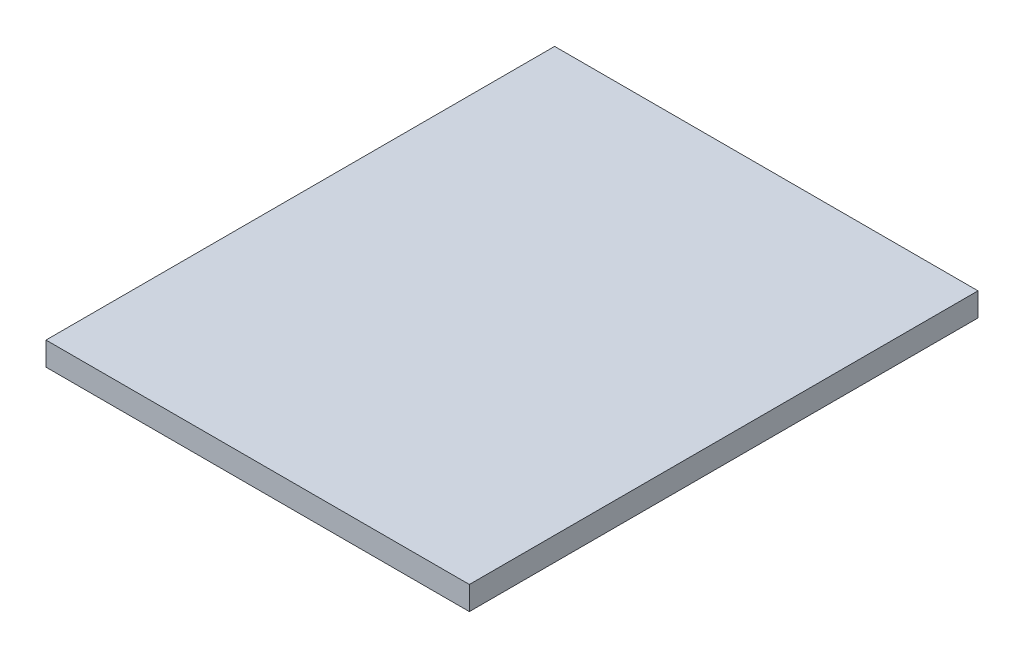
ISO-10303-21;
HEADER;
FILE_DESCRIPTION(('STEP AP214'),'2;1');
FILE_NAME('part.step','',(''),(''),'','','');
FILE_SCHEMA(('AUTOMOTIVE_DESIGN { 1 0 10303 214 1 1 1 1 }'));
ENDSEC;
DATA;
#1=APPLICATION_CONTEXT('core data for automotive mechanical design processes');
#2=APPLICATION_PROTOCOL_DEFINITION('international standard','automotive_design',2000,#1);
#3=PRODUCT_CONTEXT('',#1,'mechanical');
#4=PRODUCT('Part','Part','',(#3));
#5=PRODUCT_RELATED_PRODUCT_CATEGORY('part','',(#4));
#6=PRODUCT_DEFINITION_FORMATION('','',#4);
#7=PRODUCT_DEFINITION_CONTEXT('part definition',#1,'design');
#8=PRODUCT_DEFINITION('design','',#6,#7);
#9=PRODUCT_DEFINITION_SHAPE('','',#8);
#10=(LENGTH_UNIT() NAMED_UNIT(*) SI_UNIT(.MILLI.,.METRE.));
#11=(NAMED_UNIT(*) PLANE_ANGLE_UNIT() SI_UNIT($,.RADIAN.));
#12=(NAMED_UNIT(*) SI_UNIT($,.STERADIAN.) SOLID_ANGLE_UNIT());
#13=UNCERTAINTY_MEASURE_WITH_UNIT(LENGTH_MEASURE(1.E-05),#10,'distance_accuracy_value','');
#14=(GEOMETRIC_REPRESENTATION_CONTEXT(3) GLOBAL_UNCERTAINTY_ASSIGNED_CONTEXT((#13)) GLOBAL_UNIT_ASSIGNED_CONTEXT((#10,
#11,#12)) REPRESENTATION_CONTEXT('',''));
#15=CARTESIAN_POINT('',(0.,0.,0.));
#16=DIRECTION('',(0.,0.,1.));
#17=DIRECTION('',(1.,0.,0.));
#18=AXIS2_PLACEMENT_3D('',#15,#16,#17);
#19=CARTESIAN_POINT('',(36.,4.,43.25));
#20=DIRECTION('',(-1.,0.,0.));
#21=DIRECTION('',(0.,0.,1.));
#22=AXIS2_PLACEMENT_3D('',#19,#20,#21);
#23=PLANE('',#22);
#24=DIRECTION('',(0.,0.,-1.));
#25=VECTOR('',#24,1.);
#26=CARTESIAN_POINT('',(36.,0.,43.25));
#27=LINE('',#26,#25);
#28=CARTESIAN_POINT('',(36.,0.,43.25));
#29=VERTEX_POINT('',#28);
#30=CARTESIAN_POINT('',(36.,0.,-43.25));
#31=VERTEX_POINT('',#30);
#32=EDGE_CURVE('E97',#29,#31,#27,.T.);
#33=ORIENTED_EDGE('',*,*,#32,.T.);
#34=DIRECTION('',(0.,-1.,0.));
#35=VECTOR('',#34,1.);
#36=CARTESIAN_POINT('',(36.,4.,-43.25));
#37=LINE('',#36,#35);
#38=CARTESIAN_POINT('',(36.,4.,-43.25));
#39=VERTEX_POINT('',#38);
#40=EDGE_CURVE('E11',#39,#31,#37,.T.);
#41=ORIENTED_EDGE('',*,*,#40,.F.);
#42=DIRECTION('',(0.,0.,-1.));
#43=VECTOR('',#42,1.);
#44=CARTESIAN_POINT('',(36.,4.,43.25));
#45=LINE('',#44,#43);
#46=CARTESIAN_POINT('',(36.,4.,43.25));
#47=VERTEX_POINT('',#46);
#48=EDGE_CURVE('E85',#47,#39,#45,.T.);
#49=ORIENTED_EDGE('',*,*,#48,.F.);
#50=DIRECTION('',(0.,-1.,0.));
#51=VECTOR('',#50,1.);
#52=CARTESIAN_POINT('',(36.,4.,43.25));
#53=LINE('',#52,#51);
#54=EDGE_CURVE('E93',#47,#29,#53,.T.);
#55=ORIENTED_EDGE('',*,*,#54,.T.);
#56=EDGE_LOOP('',(#33,#41,#49,#55));
#57=FACE_BOUND('',#56,.T.);
#58=ADVANCED_FACE('F34',(#57),#23,.F.);
#59=CARTESIAN_POINT('',(-36.,4.,-43.25));
#60=DIRECTION('',(0.,0.,1.));
#61=DIRECTION('',(1.,0.,0.));
#62=AXIS2_PLACEMENT_3D('',#59,#60,#61);
#63=PLANE('',#62);
#64=DIRECTION('',(-1.,0.,0.));
#65=VECTOR('',#64,1.);
#66=CARTESIAN_POINT('',(-36.,0.,-43.25));
#67=LINE('',#66,#65);
#68=CARTESIAN_POINT('',(-36.,0.,-43.25));
#69=VERTEX_POINT('',#68);
#70=EDGE_CURVE('E89',#31,#69,#67,.T.);
#71=ORIENTED_EDGE('',*,*,#70,.T.);
#72=DIRECTION('',(0.,-1.,0.));
#73=VECTOR('',#72,1.);
#74=CARTESIAN_POINT('',(-36.,4.,-43.25));
#75=LINE('',#74,#73);
#76=CARTESIAN_POINT('',(-36.,4.,-43.25));
#77=VERTEX_POINT('',#76);
#78=EDGE_CURVE('E42',#77,#69,#75,.T.);
#79=ORIENTED_EDGE('',*,*,#78,.F.);
#80=DIRECTION('',(-1.,0.,0.));
#81=VECTOR('',#80,1.);
#82=CARTESIAN_POINT('',(-36.,4.,-43.25));
#83=LINE('',#82,#81);
#84=EDGE_CURVE('E80',#39,#77,#83,.T.);
#85=ORIENTED_EDGE('',*,*,#84,.F.);
#86=ORIENTED_EDGE('',*,*,#40,.T.);
#87=EDGE_LOOP('',(#71,#79,#85,#86));
#88=FACE_BOUND('',#87,.T.);
#89=ADVANCED_FACE('F88',(#88),#63,.F.);
#90=CARTESIAN_POINT('',(-36.,4.,43.25));
#91=DIRECTION('',(1.,0.,0.));
#92=DIRECTION('',(0.,0.,-1.));
#93=AXIS2_PLACEMENT_3D('',#90,#91,#92);
#94=PLANE('',#93);
#95=DIRECTION('',(0.,0.,1.));
#96=VECTOR('',#95,1.);
#97=CARTESIAN_POINT('',(-36.,0.,43.25));
#98=LINE('',#97,#96);
#99=CARTESIAN_POINT('',(-36.,0.,43.25));
#100=VERTEX_POINT('',#99);
#101=EDGE_CURVE('E67',#69,#100,#98,.T.);
#102=ORIENTED_EDGE('',*,*,#101,.T.);
#103=DIRECTION('',(0.,-1.,0.));
#104=VECTOR('',#103,1.);
#105=CARTESIAN_POINT('',(-36.,4.,43.25));
#106=LINE('',#105,#104);
#107=CARTESIAN_POINT('',(-36.,4.,43.25));
#108=VERTEX_POINT('',#107);
#109=EDGE_CURVE('E90',#108,#100,#106,.T.);
#110=ORIENTED_EDGE('',*,*,#109,.F.);
#111=DIRECTION('',(0.,0.,1.));
#112=VECTOR('',#111,1.);
#113=CARTESIAN_POINT('',(-36.,4.,43.25));
#114=LINE('',#113,#112);
#115=EDGE_CURVE('E83',#77,#108,#114,.T.);
#116=ORIENTED_EDGE('',*,*,#115,.F.);
#117=ORIENTED_EDGE('',*,*,#78,.T.);
#118=EDGE_LOOP('',(#102,#110,#116,#117));
#119=FACE_BOUND('',#118,.T.);
#120=ADVANCED_FACE('F91',(#119),#94,.F.);
#121=CARTESIAN_POINT('',(-36.,4.,43.25));
#122=DIRECTION('',(0.,0.,-1.));
#123=DIRECTION('',(-1.,0.,0.));
#124=AXIS2_PLACEMENT_3D('',#121,#122,#123);
#125=PLANE('',#124);
#126=DIRECTION('',(1.,0.,0.));
#127=VECTOR('',#126,1.);
#128=CARTESIAN_POINT('',(-36.,0.,43.25));
#129=LINE('',#128,#127);
#130=EDGE_CURVE('E73',#100,#29,#129,.T.);
#131=ORIENTED_EDGE('',*,*,#130,.T.);
#132=ORIENTED_EDGE('',*,*,#54,.F.);
#133=DIRECTION('',(1.,0.,0.));
#134=VECTOR('',#133,1.);
#135=CARTESIAN_POINT('',(-36.,4.,43.25));
#136=LINE('',#135,#134);
#137=EDGE_CURVE('E50',#108,#47,#136,.T.);
#138=ORIENTED_EDGE('',*,*,#137,.F.);
#139=ORIENTED_EDGE('',*,*,#109,.T.);
#140=EDGE_LOOP('',(#131,#132,#138,#139));
#141=FACE_BOUND('',#140,.T.);
#142=ADVANCED_FACE('F104',(#141),#125,.F.);
#143=CARTESIAN_POINT('',(0.,4.,0.));
#144=DIRECTION('',(0.,-1.,0.));
#145=DIRECTION('',(0.,0.,-1.));
#146=AXIS2_PLACEMENT_3D('',#143,#144,#145);
#147=PLANE('',#146);
#148=ORIENTED_EDGE('',*,*,#48,.T.);
#149=ORIENTED_EDGE('',*,*,#84,.T.);
#150=ORIENTED_EDGE('',*,*,#115,.T.);
#151=ORIENTED_EDGE('',*,*,#137,.T.);
#152=EDGE_LOOP('',(#148,#149,#150,#151));
#153=FACE_BOUND('',#152,.T.);
#154=ADVANCED_FACE('F81',(#153),#147,.F.);
#155=CARTESIAN_POINT('',(0.,0.,0.));
#156=DIRECTION('',(0.,-1.,0.));
#157=DIRECTION('',(0.,0.,-1.));
#158=AXIS2_PLACEMENT_3D('',#155,#156,#157);
#159=PLANE('',#158);
#160=ORIENTED_EDGE('',*,*,#32,.F.);
#161=ORIENTED_EDGE('',*,*,#130,.F.);
#162=ORIENTED_EDGE('',*,*,#101,.F.);
#163=ORIENTED_EDGE('',*,*,#70,.F.);
#164=EDGE_LOOP('',(#160,#161,#162,#163));
#165=FACE_BOUND('',#164,.T.);
#166=ADVANCED_FACE('F107',(#165),#159,.T.);
#167=CLOSED_SHELL('',(#58,#89,#120,#142,#154,#166));
#168=MANIFOLD_SOLID_BREP('B2',#167);
#169=ADVANCED_BREP_SHAPE_REPRESENTATION('',(#18,#168),#14);
#170=SHAPE_DEFINITION_REPRESENTATION(#9,#169);
ENDSEC;
END-ISO-10303-21;
